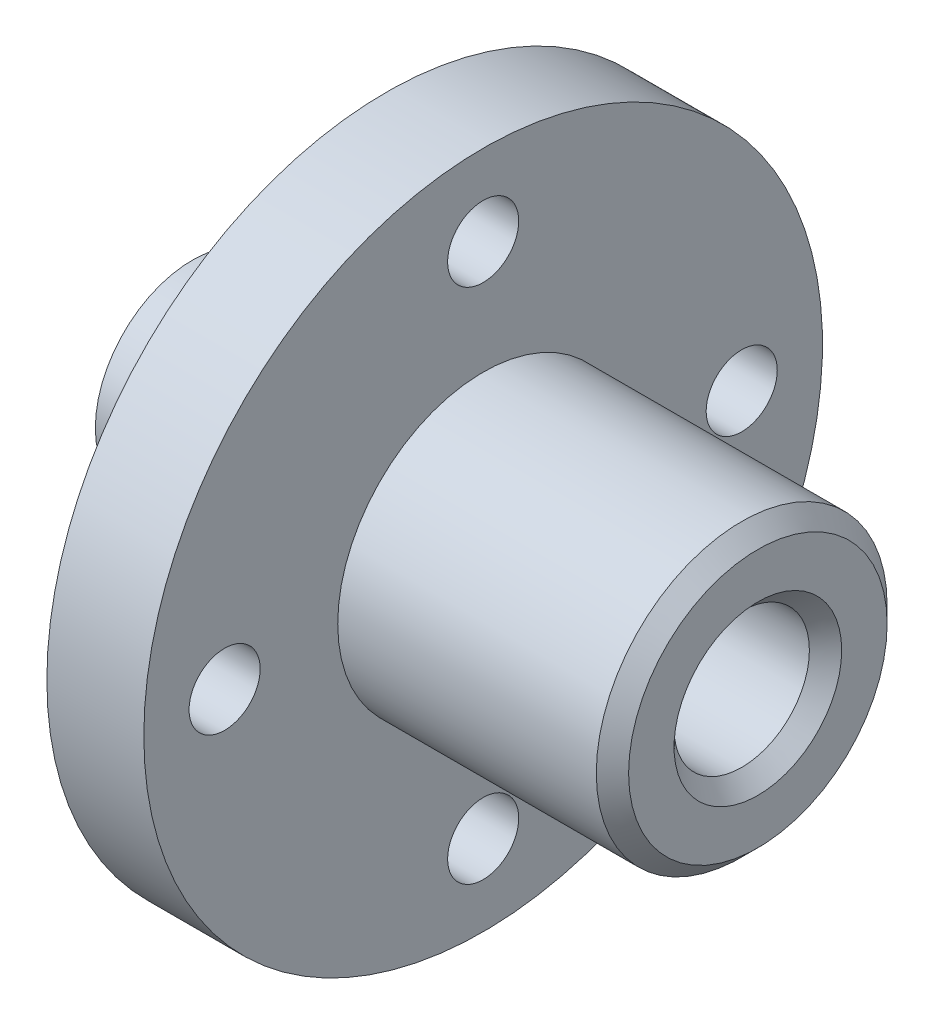
ISO-10303-21;
HEADER;
FILE_DESCRIPTION(('STEP AP214'),'2;1');
FILE_NAME('part.step','',(''),(''),'','','');
FILE_SCHEMA(('AUTOMOTIVE_DESIGN { 1 0 10303 214 1 1 1 1 }'));
ENDSEC;
DATA;
#1=APPLICATION_CONTEXT('core data for automotive mechanical design processes');
#2=APPLICATION_PROTOCOL_DEFINITION('international standard','automotive_design',2000,#1);
#3=PRODUCT_CONTEXT('',#1,'mechanical');
#4=PRODUCT('Part','Part','',(#3));
#5=PRODUCT_RELATED_PRODUCT_CATEGORY('part','',(#4));
#6=PRODUCT_DEFINITION_FORMATION('','',#4);
#7=PRODUCT_DEFINITION_CONTEXT('part definition',#1,'design');
#8=PRODUCT_DEFINITION('design','',#6,#7);
#9=PRODUCT_DEFINITION_SHAPE('','',#8);
#10=(LENGTH_UNIT() NAMED_UNIT(*) SI_UNIT(.MILLI.,.METRE.));
#11=(NAMED_UNIT(*) PLANE_ANGLE_UNIT() SI_UNIT($,.RADIAN.));
#12=(NAMED_UNIT(*) SI_UNIT($,.STERADIAN.) SOLID_ANGLE_UNIT());
#13=UNCERTAINTY_MEASURE_WITH_UNIT(LENGTH_MEASURE(1.E-05),#10,'distance_accuracy_value','');
#14=(GEOMETRIC_REPRESENTATION_CONTEXT(3) GLOBAL_UNCERTAINTY_ASSIGNED_CONTEXT((#13)) GLOBAL_UNIT_ASSIGNED_CONTEXT((#10,
#11,#12)) REPRESENTATION_CONTEXT('',''));
#15=CARTESIAN_POINT('',(0.,0.,0.));
#16=DIRECTION('',(0.,0.,1.));
#17=DIRECTION('',(1.,0.,0.));
#18=AXIS2_PLACEMENT_3D('',#15,#16,#17);
#19=CARTESIAN_POINT('',(0.,0.,0.));
#20=DIRECTION('',(-1.,0.,0.));
#21=DIRECTION('',(0.,0.,1.));
#22=AXIS2_PLACEMENT_3D('',#19,#20,#21);
#23=CYLINDRICAL_SURFACE('',#22,3.5);
#24=CARTESIAN_POINT('',(0.,0.,0.));
#25=DIRECTION('',(-1.,0.,0.));
#26=DIRECTION('',(0.,0.,1.));
#27=AXIS2_PLACEMENT_3D('',#24,#25,#26);
#28=CIRCLE('',#27,3.5);
#29=CARTESIAN_POINT('',(0.,0.,3.5));
#30=VERTEX_POINT('',#29);
#31=EDGE_CURVE('E106',#30,#30,#28,.T.);
#32=ORIENTED_EDGE('',*,*,#31,.T.);
#33=EDGE_LOOP('',(#32));
#34=FACE_BOUND('',#33,.T.);
#35=CARTESIAN_POINT('',(17.,0.,0.));
#36=DIRECTION('',(-1.,0.,0.));
#37=DIRECTION('',(0.,0.,1.));
#38=AXIS2_PLACEMENT_3D('',#35,#36,#37);
#39=CIRCLE('',#38,3.5);
#40=CARTESIAN_POINT('',(17.,0.,3.5));
#41=VERTEX_POINT('',#40);
#42=EDGE_CURVE('E74',#41,#41,#39,.T.);
#43=ORIENTED_EDGE('',*,*,#42,.F.);
#44=EDGE_LOOP('',(#43));
#45=FACE_BOUND('',#44,.T.);
#46=ADVANCED_FACE('F48',(#34,#45),#23,.F.);
#47=CARTESIAN_POINT('',(0.,-3.5,0.));
#48=DIRECTION('',(-1.,0.,0.));
#49=DIRECTION('',(0.,0.,1.));
#50=AXIS2_PLACEMENT_3D('',#47,#48,#49);
#51=PLANE('',#50);
#52=CARTESIAN_POINT('',(0.,0.,0.));
#53=DIRECTION('',(-1.,0.,0.));
#54=DIRECTION('',(0.,0.,1.));
#55=AXIS2_PLACEMENT_3D('',#52,#53,#54);
#56=CIRCLE('',#55,6.);
#57=CARTESIAN_POINT('',(0.,0.,6.00000000000001));
#58=VERTEX_POINT('',#57);
#59=EDGE_CURVE('E103',#58,#58,#56,.T.);
#60=ORIENTED_EDGE('',*,*,#59,.T.);
#61=EDGE_LOOP('',(#60));
#62=FACE_BOUND('',#61,.T.);
#63=ORIENTED_EDGE('',*,*,#31,.F.);
#64=EDGE_LOOP('',(#63));
#65=FACE_BOUND('',#64,.T.);
#66=ADVANCED_FACE('F188',(#62,#65),#51,.T.);
#67=CARTESIAN_POINT('',(0.,0.,0.));
#68=DIRECTION('',(-1.,0.,0.));
#69=DIRECTION('',(0.,0.,1.));
#70=AXIS2_PLACEMENT_3D('',#67,#68,#69);
#71=CYLINDRICAL_SURFACE('',#70,6.);
#72=CARTESIAN_POINT('',(6.2,0.,0.));
#73=DIRECTION('',(-1.,0.,0.));
#74=DIRECTION('',(0.,0.,1.));
#75=AXIS2_PLACEMENT_3D('',#72,#73,#74);
#76=CIRCLE('',#75,6.);
#77=CARTESIAN_POINT('',(6.2,0.,6.00000000000001));
#78=VERTEX_POINT('',#77);
#79=EDGE_CURVE('E100',#78,#78,#76,.T.);
#80=ORIENTED_EDGE('',*,*,#79,.T.);
#81=EDGE_LOOP('',(#80));
#82=FACE_BOUND('',#81,.T.);
#83=ORIENTED_EDGE('',*,*,#59,.F.);
#84=EDGE_LOOP('',(#83));
#85=FACE_BOUND('',#84,.T.);
#86=ADVANCED_FACE('F182',(#82,#85),#71,.T.);
#87=CARTESIAN_POINT('',(6.2,-6.00000000000001,0.));
#88=DIRECTION('',(-1.,0.,0.));
#89=DIRECTION('',(0.,0.,1.));
#90=AXIS2_PLACEMENT_3D('',#87,#88,#89);
#91=PLANE('',#90);
#92=CARTESIAN_POINT('',(6.2,0.,0.));
#93=DIRECTION('',(-1.,0.,0.));
#94=DIRECTION('',(0.,0.,1.));
#95=AXIS2_PLACEMENT_3D('',#92,#93,#94);
#96=CIRCLE('',#95,11.);
#97=CARTESIAN_POINT('',(6.2,0.,11.));
#98=VERTEX_POINT('',#97);
#99=EDGE_CURVE('E97',#98,#98,#96,.T.);
#100=ORIENTED_EDGE('',*,*,#99,.T.);
#101=EDGE_LOOP('',(#100));
#102=FACE_BOUND('',#101,.T.);
#103=ORIENTED_EDGE('',*,*,#79,.F.);
#104=EDGE_LOOP('',(#103));
#105=FACE_BOUND('',#104,.T.);
#106=ADVANCED_FACE('F176',(#102,#105),#91,.T.);
#107=CARTESIAN_POINT('',(0.,0.,0.));
#108=DIRECTION('',(-1.,0.,0.));
#109=DIRECTION('',(0.,0.,1.));
#110=AXIS2_PLACEMENT_3D('',#107,#108,#109);
#111=CYLINDRICAL_SURFACE('',#110,11.);
#112=CARTESIAN_POINT('',(8.2,0.,0.));
#113=DIRECTION('',(-1.,0.,0.));
#114=DIRECTION('',(0.,0.,1.));
#115=AXIS2_PLACEMENT_3D('',#112,#113,#114);
#116=CIRCLE('',#115,11.);
#117=CARTESIAN_POINT('',(8.2,0.,11.));
#118=VERTEX_POINT('',#117);
#119=EDGE_CURVE('E94',#118,#118,#116,.T.);
#120=ORIENTED_EDGE('',*,*,#119,.T.);
#121=EDGE_LOOP('',(#120));
#122=FACE_BOUND('',#121,.T.);
#123=ORIENTED_EDGE('',*,*,#99,.F.);
#124=EDGE_LOOP('',(#123));
#125=FACE_BOUND('',#124,.T.);
#126=ADVANCED_FACE('F170',(#122,#125),#111,.T.);
#127=CARTESIAN_POINT('',(8.2,-11.,0.));
#128=DIRECTION('',(1.,0.,0.));
#129=DIRECTION('',(0.,0.,-1.));
#130=AXIS2_PLACEMENT_3D('',#127,#128,#129);
#131=PLANE('',#130);
#132=CARTESIAN_POINT('',(8.2,0.,0.));
#133=DIRECTION('',(-1.,0.,0.));
#134=DIRECTION('',(0.,0.,1.));
#135=AXIS2_PLACEMENT_3D('',#132,#133,#134);
#136=CIRCLE('',#135,10.75);
#137=CARTESIAN_POINT('',(8.2,0.,10.75));
#138=VERTEX_POINT('',#137);
#139=EDGE_CURVE('E91',#138,#138,#136,.T.);
#140=ORIENTED_EDGE('',*,*,#139,.T.);
#141=EDGE_LOOP('',(#140));
#142=FACE_BOUND('',#141,.T.);
#143=ORIENTED_EDGE('',*,*,#119,.F.);
#144=EDGE_LOOP('',(#143));
#145=FACE_BOUND('',#144,.T.);
#146=ADVANCED_FACE('F164',(#142,#145),#131,.T.);
#147=CARTESIAN_POINT('',(0.,0.,0.));
#148=DIRECTION('',(-1.,0.,0.));
#149=DIRECTION('',(0.,0.,1.));
#150=AXIS2_PLACEMENT_3D('',#147,#148,#149);
#151=CYLINDRICAL_SURFACE('',#150,10.75);
#152=CARTESIAN_POINT('',(12.,0.,0.));
#153=DIRECTION('',(-1.,0.,0.));
#154=DIRECTION('',(0.,0.,1.));
#155=AXIS2_PLACEMENT_3D('',#152,#153,#154);
#156=CIRCLE('',#155,10.75);
#157=CARTESIAN_POINT('',(12.,0.,10.75));
#158=VERTEX_POINT('',#157);
#159=EDGE_CURVE('E88',#158,#158,#156,.T.);
#160=ORIENTED_EDGE('',*,*,#159,.T.);
#161=EDGE_LOOP('',(#160));
#162=FACE_BOUND('',#161,.T.);
#163=ORIENTED_EDGE('',*,*,#139,.F.);
#164=EDGE_LOOP('',(#163));
#165=FACE_BOUND('',#164,.T.);
#166=ADVANCED_FACE('F157',(#162,#165),#151,.T.);
#167=CARTESIAN_POINT('',(12.,-10.75,0.));
#168=DIRECTION('',(-1.,0.,0.));
#169=DIRECTION('',(0.,0.,1.));
#170=AXIS2_PLACEMENT_3D('',#167,#168,#169);
#171=PLANE('',#170);
#172=CARTESIAN_POINT('',(12.,-16.,0.));
#173=DIRECTION('',(-1.,0.,0.));
#174=DIRECTION('',(0.,0.,-1.));
#175=AXIS2_PLACEMENT_3D('',#172,#173,#174);
#176=CIRCLE('',#175,2.2);
#177=CARTESIAN_POINT('',(12.,-16.,-2.20000000000001));
#178=VERTEX_POINT('',#177);
#179=EDGE_CURVE('E268',#178,#178,#176,.T.);
#180=ORIENTED_EDGE('',*,*,#179,.F.);
#181=EDGE_LOOP('',(#180));
#182=FACE_BOUND('',#181,.T.);
#183=CARTESIAN_POINT('',(12.,1.64860885394524E-13,16.));
#184=DIRECTION('',(-1.,0.,0.));
#185=DIRECTION('',(0.,-1.,0.));
#186=AXIS2_PLACEMENT_3D('',#183,#184,#185);
#187=CIRCLE('',#186,2.2);
#188=CARTESIAN_POINT('',(12.,-2.19999999999984,16.));
#189=VERTEX_POINT('',#188);
#190=EDGE_CURVE('E274',#189,#189,#187,.T.);
#191=ORIENTED_EDGE('',*,*,#190,.F.);
#192=EDGE_LOOP('',(#191));
#193=FACE_BOUND('',#192,.T.);
#194=CARTESIAN_POINT('',(12.,0.,-16.));
#195=DIRECTION('',(-1.,0.,0.));
#196=DIRECTION('',(0.,1.,0.));
#197=AXIS2_PLACEMENT_3D('',#194,#195,#196);
#198=CIRCLE('',#197,2.2);
#199=CARTESIAN_POINT('',(12.,2.19999999999995,-16.));
#200=VERTEX_POINT('',#199);
#201=EDGE_CURVE('E272',#200,#200,#198,.T.);
#202=ORIENTED_EDGE('',*,*,#201,.F.);
#203=EDGE_LOOP('',(#202));
#204=FACE_BOUND('',#203,.T.);
#205=CARTESIAN_POINT('',(12.,16.,0.));
#206=DIRECTION('',(-1.,0.,0.));
#207=DIRECTION('',(0.,0.,1.));
#208=AXIS2_PLACEMENT_3D('',#205,#206,#207);
#209=CIRCLE('',#208,2.2);
#210=CARTESIAN_POINT('',(12.,16.,2.20000000000001));
#211=VERTEX_POINT('',#210);
#212=EDGE_CURVE('E283',#211,#211,#209,.T.);
#213=ORIENTED_EDGE('',*,*,#212,.F.);
#214=EDGE_LOOP('',(#213));
#215=FACE_BOUND('',#214,.T.);
#216=CARTESIAN_POINT('',(12.,0.,0.));
#217=DIRECTION('',(-1.,0.,0.));
#218=DIRECTION('',(0.,0.,1.));
#219=AXIS2_PLACEMENT_3D('',#216,#217,#218);
#220=CIRCLE('',#219,21.);
#221=CARTESIAN_POINT('',(12.,0.,21.));
#222=VERTEX_POINT('',#221);
#223=EDGE_CURVE('E85',#222,#222,#220,.T.);
#224=ORIENTED_EDGE('',*,*,#223,.T.);
#225=EDGE_LOOP('',(#224));
#226=FACE_BOUND('',#225,.T.);
#227=ORIENTED_EDGE('',*,*,#159,.F.);
#228=EDGE_LOOP('',(#227));
#229=FACE_BOUND('',#228,.T.);
#230=ADVANCED_FACE('F151',(#182,#193,#204,#215,#226,#229),#171,.T.);
#231=CARTESIAN_POINT('',(0.,0.,0.));
#232=DIRECTION('',(-1.,0.,0.));
#233=DIRECTION('',(0.,0.,1.));
#234=AXIS2_PLACEMENT_3D('',#231,#232,#233);
#235=CYLINDRICAL_SURFACE('',#234,21.);
#236=CARTESIAN_POINT('',(18.,0.,0.));
#237=DIRECTION('',(-1.,0.,0.));
#238=DIRECTION('',(0.,0.,1.));
#239=AXIS2_PLACEMENT_3D('',#236,#237,#238);
#240=CIRCLE('',#239,21.);
#241=CARTESIAN_POINT('',(18.,0.,21.));
#242=VERTEX_POINT('',#241);
#243=EDGE_CURVE('E77',#242,#242,#240,.T.);
#244=ORIENTED_EDGE('',*,*,#243,.T.);
#245=EDGE_LOOP('',(#244));
#246=FACE_BOUND('',#245,.T.);
#247=ORIENTED_EDGE('',*,*,#223,.F.);
#248=EDGE_LOOP('',(#247));
#249=FACE_BOUND('',#248,.T.);
#250=ADVANCED_FACE('F144',(#246,#249),#235,.T.);
#251=CARTESIAN_POINT('',(18.,-21.,0.));
#252=DIRECTION('',(1.,0.,0.));
#253=DIRECTION('',(0.,0.,-1.));
#254=AXIS2_PLACEMENT_3D('',#251,#252,#253);
#255=PLANE('',#254);
#256=CARTESIAN_POINT('',(18.,-16.,0.));
#257=DIRECTION('',(1.,0.,0.));
#258=DIRECTION('',(0.,0.,1.));
#259=AXIS2_PLACEMENT_3D('',#256,#257,#258);
#260=CIRCLE('',#259,2.2);
#261=CARTESIAN_POINT('',(18.,-16.,2.2));
#262=VERTEX_POINT('',#261);
#263=EDGE_CURVE('E265',#262,#262,#260,.T.);
#264=ORIENTED_EDGE('',*,*,#263,.F.);
#265=EDGE_LOOP('',(#264));
#266=FACE_BOUND('',#265,.T.);
#267=CARTESIAN_POINT('',(18.,1.64860885394524E-13,16.));
#268=DIRECTION('',(1.,0.,0.));
#269=DIRECTION('',(0.,1.,0.));
#270=AXIS2_PLACEMENT_3D('',#267,#268,#269);
#271=CIRCLE('',#270,2.2);
#272=CARTESIAN_POINT('',(18.,2.20000000000017,16.));
#273=VERTEX_POINT('',#272);
#274=EDGE_CURVE('E277',#273,#273,#271,.T.);
#275=ORIENTED_EDGE('',*,*,#274,.F.);
#276=EDGE_LOOP('',(#275));
#277=FACE_BOUND('',#276,.T.);
#278=CARTESIAN_POINT('',(18.,0.,-16.));
#279=DIRECTION('',(1.,0.,0.));
#280=DIRECTION('',(0.,-1.,0.));
#281=AXIS2_PLACEMENT_3D('',#278,#279,#280);
#282=CIRCLE('',#281,2.2);
#283=CARTESIAN_POINT('',(18.,-2.20000000000006,-16.));
#284=VERTEX_POINT('',#283);
#285=EDGE_CURVE('E269',#284,#284,#282,.T.);
#286=ORIENTED_EDGE('',*,*,#285,.F.);
#287=EDGE_LOOP('',(#286));
#288=FACE_BOUND('',#287,.T.);
#289=CARTESIAN_POINT('',(18.,16.,0.));
#290=DIRECTION('',(1.,0.,0.));
#291=DIRECTION('',(0.,0.,-1.));
#292=AXIS2_PLACEMENT_3D('',#289,#290,#291);
#293=CIRCLE('',#292,2.2);
#294=CARTESIAN_POINT('',(18.,16.,-2.2));
#295=VERTEX_POINT('',#294);
#296=EDGE_CURVE('E52',#295,#295,#293,.T.);
#297=ORIENTED_EDGE('',*,*,#296,.F.);
#298=EDGE_LOOP('',(#297));
#299=FACE_BOUND('',#298,.T.);
#300=CARTESIAN_POINT('',(18.,0.,0.));
#301=DIRECTION('',(-1.,0.,0.));
#302=DIRECTION('',(0.,0.,1.));
#303=AXIS2_PLACEMENT_3D('',#300,#301,#302);
#304=CIRCLE('',#303,9.);
#305=CARTESIAN_POINT('',(18.,0.,9.00000000000001));
#306=VERTEX_POINT('',#305);
#307=EDGE_CURVE('E73',#306,#306,#304,.T.);
#308=ORIENTED_EDGE('',*,*,#307,.T.);
#309=EDGE_LOOP('',(#308));
#310=FACE_BOUND('',#309,.T.);
#311=ORIENTED_EDGE('',*,*,#243,.F.);
#312=EDGE_LOOP('',(#311));
#313=FACE_BOUND('',#312,.T.);
#314=ADVANCED_FACE('F138',(#266,#277,#288,#299,#310,#313),#255,.T.);
#315=CARTESIAN_POINT('',(0.,0.,0.));
#316=DIRECTION('',(-1.,0.,0.));
#317=DIRECTION('',(0.,0.,1.));
#318=AXIS2_PLACEMENT_3D('',#315,#316,#317);
#319=CYLINDRICAL_SURFACE('',#318,9.);
#320=CARTESIAN_POINT('',(34.,0.,0.));
#321=DIRECTION('',(1.,0.,0.));
#322=DIRECTION('',(0.,0.,-1.));
#323=AXIS2_PLACEMENT_3D('',#320,#321,#322);
#324=CIRCLE('',#323,9.);
#325=CARTESIAN_POINT('',(34.,0.,-9.00000000000001));
#326=VERTEX_POINT('',#325);
#327=EDGE_CURVE('E13',#326,#326,#324,.F.);
#328=ORIENTED_EDGE('',*,*,#327,.T.);
#329=EDGE_LOOP('',(#328));
#330=FACE_BOUND('',#329,.T.);
#331=ORIENTED_EDGE('',*,*,#307,.F.);
#332=EDGE_LOOP('',(#331));
#333=FACE_BOUND('',#332,.T.);
#334=ADVANCED_FACE('F127',(#330,#333),#319,.T.);
#335=CARTESIAN_POINT('',(35.,-9.00000000000001,0.));
#336=DIRECTION('',(1.,0.,0.));
#337=DIRECTION('',(0.,0.,-1.));
#338=AXIS2_PLACEMENT_3D('',#335,#336,#337);
#339=PLANE('',#338);
#340=CARTESIAN_POINT('',(35.,0.,0.));
#341=DIRECTION('',(1.,0.,0.));
#342=DIRECTION('',(0.,0.,-1.));
#343=AXIS2_PLACEMENT_3D('',#340,#341,#342);
#344=CIRCLE('',#343,5.18800000000001);
#345=CARTESIAN_POINT('',(35.,0.,-5.18800000000002));
#346=VERTEX_POINT('',#345);
#347=EDGE_CURVE('E112',#346,#346,#344,.F.);
#348=ORIENTED_EDGE('',*,*,#347,.T.);
#349=EDGE_LOOP('',(#348));
#350=FACE_BOUND('',#349,.T.);
#351=CARTESIAN_POINT('',(35.,0.,0.));
#352=DIRECTION('',(1.,0.,0.));
#353=DIRECTION('',(0.,0.,-1.));
#354=AXIS2_PLACEMENT_3D('',#351,#352,#353);
#355=CIRCLE('',#354,7.99999999999999);
#356=CARTESIAN_POINT('',(35.,0.,-8.));
#357=VERTEX_POINT('',#356);
#358=EDGE_CURVE('E109',#357,#357,#355,.T.);
#359=ORIENTED_EDGE('',*,*,#358,.T.);
#360=EDGE_LOOP('',(#359));
#361=FACE_BOUND('',#360,.T.);
#362=ADVANCED_FACE('F124',(#350,#361),#339,.T.);
#363=CARTESIAN_POINT('',(0.,0.,0.));
#364=DIRECTION('',(-1.,0.,0.));
#365=DIRECTION('',(0.,0.,1.));
#366=AXIS2_PLACEMENT_3D('',#363,#364,#365);
#367=CYLINDRICAL_SURFACE('',#366,4.188);
#368=CARTESIAN_POINT('',(34.,0.,0.));
#369=DIRECTION('',(1.,0.,0.));
#370=DIRECTION('',(0.,0.,-1.));
#371=AXIS2_PLACEMENT_3D('',#368,#369,#370);
#372=CIRCLE('',#371,4.188);
#373=CARTESIAN_POINT('',(34.,0.,-4.18800000000001));
#374=VERTEX_POINT('',#373);
#375=EDGE_CURVE('E57',#374,#374,#372,.T.);
#376=ORIENTED_EDGE('',*,*,#375,.T.);
#377=EDGE_LOOP('',(#376));
#378=FACE_BOUND('',#377,.T.);
#379=CARTESIAN_POINT('',(25.,0.,0.));
#380=DIRECTION('',(-1.,0.,0.));
#381=DIRECTION('',(0.,0.,1.));
#382=AXIS2_PLACEMENT_3D('',#379,#380,#381);
#383=CIRCLE('',#382,4.188);
#384=CARTESIAN_POINT('',(25.,0.,4.18800000000001));
#385=VERTEX_POINT('',#384);
#386=EDGE_CURVE('E71',#385,#385,#383,.T.);
#387=ORIENTED_EDGE('',*,*,#386,.T.);
#388=EDGE_LOOP('',(#387));
#389=FACE_BOUND('',#388,.T.);
#390=ADVANCED_FACE('F67',(#378,#389),#367,.F.);
#391=CARTESIAN_POINT('',(25.,0.,0.));
#392=DIRECTION('',(1.,0.,0.));
#393=DIRECTION('',(0.,0.,-1.));
#394=AXIS2_PLACEMENT_3D('',#391,#392,#393);
#395=CONICAL_SURFACE('',#394,4.188,1.04719755119659);
#396=CARTESIAN_POINT('',(22.5820570726338,0.,0.));
#397=VERTEX_POINT('',#396);
#398=VERTEX_LOOP('',#397);
#399=FACE_BOUND('',#398,.T.);
#400=ORIENTED_EDGE('',*,*,#386,.F.);
#401=EDGE_LOOP('',(#400));
#402=FACE_BOUND('',#401,.T.);
#403=ADVANCED_FACE('F63',(#399,#402),#395,.F.);
#404=CARTESIAN_POINT('',(19.0207259421637,0.,0.));
#405=DIRECTION('',(-1.,0.,0.));
#406=DIRECTION('',(0.,0.,1.));
#407=AXIS2_PLACEMENT_3D('',#404,#405,#406);
#408=CONICAL_SURFACE('',#407,0.,1.0471975511966);
#409=ORIENTED_EDGE('',*,*,#42,.T.);
#410=EDGE_LOOP('',(#409));
#411=FACE_BOUND('',#410,.T.);
#412=CARTESIAN_POINT('',(19.0207259421637,0.,0.));
#413=VERTEX_POINT('',#412);
#414=VERTEX_LOOP('',#413);
#415=FACE_BOUND('',#414,.T.);
#416=ADVANCED_FACE('F66',(#411,#415),#408,.F.);
#417=CARTESIAN_POINT('',(35.,0.,0.));
#418=DIRECTION('',(1.,0.,0.));
#419=DIRECTION('',(0.,0.,-1.));
#420=AXIS2_PLACEMENT_3D('',#417,#418,#419);
#421=CONICAL_SURFACE('',#420,5.18800000000001,0.78539816339745);
#422=ORIENTED_EDGE('',*,*,#375,.F.);
#423=EDGE_LOOP('',(#422));
#424=FACE_BOUND('',#423,.T.);
#425=ORIENTED_EDGE('',*,*,#347,.F.);
#426=EDGE_LOOP('',(#425));
#427=FACE_BOUND('',#426,.T.);
#428=ADVANCED_FACE('F119',(#424,#427),#421,.F.);
#429=CARTESIAN_POINT('',(34.,0.,0.));
#430=DIRECTION('',(-1.,0.,0.));
#431=DIRECTION('',(0.,0.,1.));
#432=AXIS2_PLACEMENT_3D('',#429,#430,#431);
#433=CONICAL_SURFACE('',#432,9.,0.785398163397458);
#434=ORIENTED_EDGE('',*,*,#358,.F.);
#435=EDGE_LOOP('',(#434));
#436=FACE_BOUND('',#435,.T.);
#437=ORIENTED_EDGE('',*,*,#327,.F.);
#438=EDGE_LOOP('',(#437));
#439=FACE_BOUND('',#438,.T.);
#440=ADVANCED_FACE('F50',(#436,#439),#433,.T.);
#441=CARTESIAN_POINT('',(35.,16.,0.));
#442=DIRECTION('',(-1.,0.,0.));
#443=DIRECTION('',(0.,0.,1.));
#444=AXIS2_PLACEMENT_3D('',#441,#442,#443);
#445=CYLINDRICAL_SURFACE('',#444,2.2);
#446=ORIENTED_EDGE('',*,*,#296,.T.);
#447=EDGE_LOOP('',(#446));
#448=FACE_BOUND('',#447,.T.);
#449=ORIENTED_EDGE('',*,*,#212,.T.);
#450=EDGE_LOOP('',(#449));
#451=FACE_BOUND('',#450,.T.);
#452=ADVANCED_FACE('F133',(#448,#451),#445,.F.);
#453=CARTESIAN_POINT('',(35.,0.,-16.));
#454=DIRECTION('',(-1.,0.,0.));
#455=DIRECTION('',(0.,1.,0.));
#456=AXIS2_PLACEMENT_3D('',#453,#454,#455);
#457=CYLINDRICAL_SURFACE('',#456,2.2);
#458=ORIENTED_EDGE('',*,*,#285,.T.);
#459=EDGE_LOOP('',(#458));
#460=FACE_BOUND('',#459,.T.);
#461=ORIENTED_EDGE('',*,*,#201,.T.);
#462=EDGE_LOOP('',(#461));
#463=FACE_BOUND('',#462,.T.);
#464=ADVANCED_FACE('F238',(#460,#463),#457,.F.);
#465=CARTESIAN_POINT('',(35.,1.64860885394524E-13,16.));
#466=DIRECTION('',(-1.,0.,0.));
#467=DIRECTION('',(0.,-1.,0.));
#468=AXIS2_PLACEMENT_3D('',#465,#466,#467);
#469=CYLINDRICAL_SURFACE('',#468,2.2);
#470=ORIENTED_EDGE('',*,*,#274,.T.);
#471=EDGE_LOOP('',(#470));
#472=FACE_BOUND('',#471,.T.);
#473=ORIENTED_EDGE('',*,*,#190,.T.);
#474=EDGE_LOOP('',(#473));
#475=FACE_BOUND('',#474,.T.);
#476=ADVANCED_FACE('F245',(#472,#475),#469,.F.);
#477=CARTESIAN_POINT('',(35.,-16.,0.));
#478=DIRECTION('',(-1.,0.,0.));
#479=DIRECTION('',(0.,0.,-1.));
#480=AXIS2_PLACEMENT_3D('',#477,#478,#479);
#481=CYLINDRICAL_SURFACE('',#480,2.2);
#482=ORIENTED_EDGE('',*,*,#263,.T.);
#483=EDGE_LOOP('',(#482));
#484=FACE_BOUND('',#483,.T.);
#485=ORIENTED_EDGE('',*,*,#179,.T.);
#486=EDGE_LOOP('',(#485));
#487=FACE_BOUND('',#486,.T.);
#488=ADVANCED_FACE('F252',(#484,#487),#481,.F.);
#489=CLOSED_SHELL('',(#46,#66,#86,#106,#126,#146,#166,#230,#250,#314,#334,#362,#390,#403,#416,
#428,#440,#452,#464,#476,#488));
#490=MANIFOLD_SOLID_BREP('B2',#489);
#491=ADVANCED_BREP_SHAPE_REPRESENTATION('',(#18,#490),#14);
#492=SHAPE_DEFINITION_REPRESENTATION(#9,#491);
ENDSEC;
END-ISO-10303-21;
